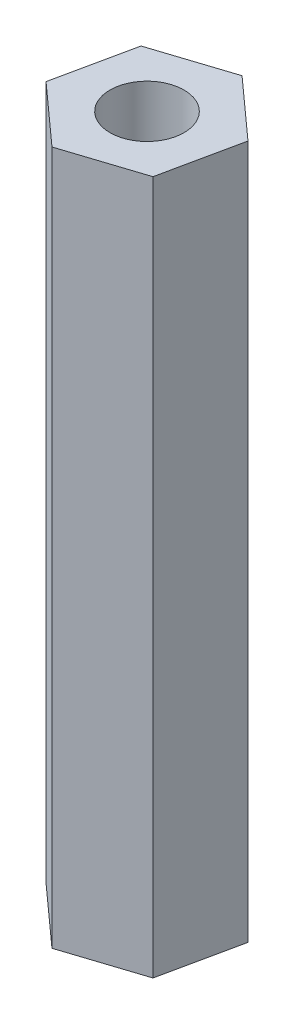
ISO-10303-21;
HEADER;
FILE_DESCRIPTION(('STEP AP214'),'2;1');
FILE_NAME('part.step','',(''),(''),'','','');
FILE_SCHEMA(('AUTOMOTIVE_DESIGN { 1 0 10303 214 1 1 1 1 }'));
ENDSEC;
DATA;
#1=APPLICATION_CONTEXT('core data for automotive mechanical design processes');
#2=APPLICATION_PROTOCOL_DEFINITION('international standard','automotive_design',2000,#1);
#3=PRODUCT_CONTEXT('',#1,'mechanical');
#4=PRODUCT('Part','Part','',(#3));
#5=PRODUCT_RELATED_PRODUCT_CATEGORY('part','',(#4));
#6=PRODUCT_DEFINITION_FORMATION('','',#4);
#7=PRODUCT_DEFINITION_CONTEXT('part definition',#1,'design');
#8=PRODUCT_DEFINITION('design','',#6,#7);
#9=PRODUCT_DEFINITION_SHAPE('','',#8);
#10=(LENGTH_UNIT() NAMED_UNIT(*) SI_UNIT(.MILLI.,.METRE.));
#11=(NAMED_UNIT(*) PLANE_ANGLE_UNIT() SI_UNIT($,.RADIAN.));
#12=(NAMED_UNIT(*) SI_UNIT($,.STERADIAN.) SOLID_ANGLE_UNIT());
#13=UNCERTAINTY_MEASURE_WITH_UNIT(LENGTH_MEASURE(1.E-05),#10,'distance_accuracy_value','');
#14=(GEOMETRIC_REPRESENTATION_CONTEXT(3) GLOBAL_UNCERTAINTY_ASSIGNED_CONTEXT((#13)) GLOBAL_UNIT_ASSIGNED_CONTEXT((#10,
#11,#12)) REPRESENTATION_CONTEXT('',''));
#15=CARTESIAN_POINT('',(0.,0.,0.));
#16=DIRECTION('',(0.,0.,1.));
#17=DIRECTION('',(1.,0.,0.));
#18=AXIS2_PLACEMENT_3D('',#15,#16,#17);
#19=CARTESIAN_POINT('',(0.,30.,0.));
#20=DIRECTION('',(0.,1.,0.));
#21=DIRECTION('',(0.,0.,1.));
#22=AXIS2_PLACEMENT_3D('',#19,#20,#21);
#23=PLANE('',#22);
#24=DIRECTION('',(0.95098752494446,0.,-0.309229247323097));
#25=VECTOR('',#24,1.);
#26=CARTESIAN_POINT('',(-0.719470968598688,30.,3.38856334238327));
#27=LINE('',#26,#25);
#28=CARTESIAN_POINT('',(-0.719470968598688,30.,3.38856334238327));
#29=VERTEX_POINT('',#28);
#30=CARTESIAN_POINT('',(2.57484645253727,30.,2.3173618072835));
#31=VERTEX_POINT('',#30);
#32=EDGE_CURVE('E150',#29,#31,#27,.T.);
#33=ORIENTED_EDGE('',*,*,#32,.T.);
#34=DIRECTION('',(0.207693378697287,0.,-0.978193978945539));
#35=VECTOR('',#34,1.);
#36=CARTESIAN_POINT('',(2.57484645253727,30.,2.3173618072835));
#37=LINE('',#36,#35);
#38=CARTESIAN_POINT('',(3.29431742113596,30.,-1.07120153509977));
#39=VERTEX_POINT('',#38);
#40=EDGE_CURVE('E98',#31,#39,#37,.T.);
#41=ORIENTED_EDGE('',*,*,#40,.T.);
#42=DIRECTION('',(-0.743294146247174,0.,-0.668964731622442));
#43=VECTOR('',#42,1.);
#44=CARTESIAN_POINT('',(3.29431742113596,30.,-1.07120153509977));
#45=LINE('',#44,#43);
#46=CARTESIAN_POINT('',(0.719470968598688,30.,-3.38856334238327));
#47=VERTEX_POINT('',#46);
#48=EDGE_CURVE('E111',#39,#47,#45,.T.);
#49=ORIENTED_EDGE('',*,*,#48,.T.);
#50=DIRECTION('',(-0.95098752494446,0.,0.309229247323097));
#51=VECTOR('',#50,1.);
#52=CARTESIAN_POINT('',(0.719470968598688,30.,-3.38856334238327));
#53=LINE('',#52,#51);
#54=CARTESIAN_POINT('',(-2.57484645253727,30.,-2.3173618072835));
#55=VERTEX_POINT('',#54);
#56=EDGE_CURVE('E105',#47,#55,#53,.T.);
#57=ORIENTED_EDGE('',*,*,#56,.T.);
#58=DIRECTION('',(-0.207693378697287,0.,0.978193978945539));
#59=VECTOR('',#58,1.);
#60=CARTESIAN_POINT('',(-2.57484645253727,30.,-2.3173618072835));
#61=LINE('',#60,#59);
#62=CARTESIAN_POINT('',(-3.29431742113596,30.,1.07120153509978));
#63=VERTEX_POINT('',#62);
#64=EDGE_CURVE('E109',#55,#63,#61,.T.);
#65=ORIENTED_EDGE('',*,*,#64,.T.);
#66=DIRECTION('',(0.743294146247174,0.,0.668964731622442));
#67=VECTOR('',#66,1.);
#68=CARTESIAN_POINT('',(-3.29431742113596,30.,1.07120153509978));
#69=LINE('',#68,#67);
#70=EDGE_CURVE('E61',#63,#29,#69,.T.);
#71=ORIENTED_EDGE('',*,*,#70,.T.);
#72=EDGE_LOOP('',(#33,#41,#49,#57,#65,#71));
#73=FACE_BOUND('',#72,.T.);
#74=CARTESIAN_POINT('',(0.,30.,0.));
#75=DIRECTION('',(0.,1.,0.));
#76=DIRECTION('',(0.,0.,1.));
#77=AXIS2_PLACEMENT_3D('',#74,#75,#76);
#78=CIRCLE('',#77,1.6);
#79=CARTESIAN_POINT('',(0.,30.,1.6));
#80=VERTEX_POINT('',#79);
#81=EDGE_CURVE('E138',#80,#80,#78,.T.);
#82=ORIENTED_EDGE('',*,*,#81,.F.);
#83=EDGE_LOOP('',(#82));
#84=FACE_BOUND('',#83,.T.);
#85=ADVANCED_FACE('F43',(#73,#84),#23,.T.);
#86=CARTESIAN_POINT('',(0.,0.,0.));
#87=DIRECTION('',(0.,1.,0.));
#88=DIRECTION('',(0.,0.,1.));
#89=AXIS2_PLACEMENT_3D('',#86,#87,#88);
#90=PLANE('',#89);
#91=DIRECTION('',(0.95098752494446,0.,-0.309229247323097));
#92=VECTOR('',#91,1.);
#93=CARTESIAN_POINT('',(-0.719470968598688,0.,3.38856334238327));
#94=LINE('',#93,#92);
#95=CARTESIAN_POINT('',(-0.719470968598688,0.,3.38856334238327));
#96=VERTEX_POINT('',#95);
#97=CARTESIAN_POINT('',(2.57484645253727,0.,2.3173618072835));
#98=VERTEX_POINT('',#97);
#99=EDGE_CURVE('E133',#96,#98,#94,.T.);
#100=ORIENTED_EDGE('',*,*,#99,.F.);
#101=DIRECTION('',(0.743294146247174,0.,0.668964731622442));
#102=VECTOR('',#101,1.);
#103=CARTESIAN_POINT('',(-3.29431742113596,0.,1.07120153509978));
#104=LINE('',#103,#102);
#105=CARTESIAN_POINT('',(-3.29431742113596,0.,1.07120153509978));
#106=VERTEX_POINT('',#105);
#107=EDGE_CURVE('E90',#106,#96,#104,.T.);
#108=ORIENTED_EDGE('',*,*,#107,.F.);
#109=DIRECTION('',(-0.207693378697287,0.,0.978193978945539));
#110=VECTOR('',#109,1.);
#111=CARTESIAN_POINT('',(-2.57484645253727,0.,-2.3173618072835));
#112=LINE('',#111,#110);
#113=CARTESIAN_POINT('',(-2.57484645253727,0.,-2.3173618072835));
#114=VERTEX_POINT('',#113);
#115=EDGE_CURVE('E84',#114,#106,#112,.T.);
#116=ORIENTED_EDGE('',*,*,#115,.F.);
#117=DIRECTION('',(-0.95098752494446,0.,0.309229247323097));
#118=VECTOR('',#117,1.);
#119=CARTESIAN_POINT('',(0.719470968598688,0.,-3.38856334238327));
#120=LINE('',#119,#118);
#121=CARTESIAN_POINT('',(0.719470968598688,0.,-3.38856334238327));
#122=VERTEX_POINT('',#121);
#123=EDGE_CURVE('E120',#122,#114,#120,.T.);
#124=ORIENTED_EDGE('',*,*,#123,.F.);
#125=DIRECTION('',(-0.743294146247174,0.,-0.668964731622442));
#126=VECTOR('',#125,1.);
#127=CARTESIAN_POINT('',(3.29431742113596,0.,-1.07120153509977));
#128=LINE('',#127,#126);
#129=CARTESIAN_POINT('',(3.29431742113596,0.,-1.07120153509977));
#130=VERTEX_POINT('',#129);
#131=EDGE_CURVE('E141',#130,#122,#128,.T.);
#132=ORIENTED_EDGE('',*,*,#131,.F.);
#133=DIRECTION('',(0.207693378697287,0.,-0.978193978945539));
#134=VECTOR('',#133,1.);
#135=CARTESIAN_POINT('',(2.57484645253727,0.,2.3173618072835));
#136=LINE('',#135,#134);
#137=EDGE_CURVE('E137',#98,#130,#136,.T.);
#138=ORIENTED_EDGE('',*,*,#137,.F.);
#139=EDGE_LOOP('',(#100,#108,#116,#124,#132,#138));
#140=FACE_BOUND('',#139,.T.);
#141=CARTESIAN_POINT('',(0.,0.,0.));
#142=DIRECTION('',(0.,1.,0.));
#143=DIRECTION('',(0.,0.,1.));
#144=AXIS2_PLACEMENT_3D('',#141,#142,#143);
#145=CIRCLE('',#144,1.6);
#146=CARTESIAN_POINT('',(0.,0.,1.6));
#147=VERTEX_POINT('',#146);
#148=EDGE_CURVE('E265',#147,#147,#145,.T.);
#149=ORIENTED_EDGE('',*,*,#148,.T.);
#150=EDGE_LOOP('',(#149));
#151=FACE_BOUND('',#150,.T.);
#152=ADVANCED_FACE('F163',(#140,#151),#90,.F.);
#153=CARTESIAN_POINT('',(-0.719470968598688,30.,3.38856334238327));
#154=DIRECTION('',(-0.309229247323097,0.,-0.95098752494446));
#155=DIRECTION('',(-0.95098752494446,0.,0.309229247323097));
#156=AXIS2_PLACEMENT_3D('',#153,#154,#155);
#157=PLANE('',#156);
#158=ORIENTED_EDGE('',*,*,#99,.T.);
#159=DIRECTION('',(0.,-1.,0.));
#160=VECTOR('',#159,1.);
#161=CARTESIAN_POINT('',(2.57484645253727,30.,2.3173618072835));
#162=LINE('',#161,#160);
#163=EDGE_CURVE('E11',#31,#98,#162,.T.);
#164=ORIENTED_EDGE('',*,*,#163,.F.);
#165=ORIENTED_EDGE('',*,*,#32,.F.);
#166=DIRECTION('',(0.,-1.,0.));
#167=VECTOR('',#166,1.);
#168=CARTESIAN_POINT('',(-0.719470968598688,30.,3.38856334238327));
#169=LINE('',#168,#167);
#170=EDGE_CURVE('E129',#29,#96,#169,.T.);
#171=ORIENTED_EDGE('',*,*,#170,.T.);
#172=EDGE_LOOP('',(#158,#164,#165,#171));
#173=FACE_BOUND('',#172,.T.);
#174=ADVANCED_FACE('F45',(#173),#157,.F.);
#175=CARTESIAN_POINT('',(2.57484645253727,30.,2.3173618072835));
#176=DIRECTION('',(-0.978193978945539,0.,-0.207693378697286));
#177=DIRECTION('',(-0.207693378697287,0.,0.978193978945539));
#178=AXIS2_PLACEMENT_3D('',#175,#176,#177);
#179=PLANE('',#178);
#180=ORIENTED_EDGE('',*,*,#137,.T.);
#181=DIRECTION('',(0.,-1.,0.));
#182=VECTOR('',#181,1.);
#183=CARTESIAN_POINT('',(3.29431742113596,30.,-1.07120153509977));
#184=LINE('',#183,#182);
#185=EDGE_CURVE('E53',#39,#130,#184,.T.);
#186=ORIENTED_EDGE('',*,*,#185,.F.);
#187=ORIENTED_EDGE('',*,*,#40,.F.);
#188=ORIENTED_EDGE('',*,*,#163,.T.);
#189=EDGE_LOOP('',(#180,#186,#187,#188));
#190=FACE_BOUND('',#189,.T.);
#191=ADVANCED_FACE('F188',(#190),#179,.F.);
#192=CARTESIAN_POINT('',(3.29431742113596,30.,-1.07120153509977));
#193=DIRECTION('',(-0.668964731622442,0.,0.743294146247174));
#194=DIRECTION('',(0.743294146247174,0.,0.668964731622442));
#195=AXIS2_PLACEMENT_3D('',#192,#193,#194);
#196=PLANE('',#195);
#197=ORIENTED_EDGE('',*,*,#131,.T.);
#198=DIRECTION('',(0.,-1.,0.));
#199=VECTOR('',#198,1.);
#200=CARTESIAN_POINT('',(0.719470968598688,30.,-3.38856334238327));
#201=LINE('',#200,#199);
#202=EDGE_CURVE('E122',#47,#122,#201,.T.);
#203=ORIENTED_EDGE('',*,*,#202,.F.);
#204=ORIENTED_EDGE('',*,*,#48,.F.);
#205=ORIENTED_EDGE('',*,*,#185,.T.);
#206=EDGE_LOOP('',(#197,#203,#204,#205));
#207=FACE_BOUND('',#206,.T.);
#208=ADVANCED_FACE('F160',(#207),#196,.F.);
#209=CARTESIAN_POINT('',(0.719470968598688,30.,-3.38856334238327));
#210=DIRECTION('',(0.309229247323097,0.,0.95098752494446));
#211=DIRECTION('',(0.95098752494446,0.,-0.309229247323097));
#212=AXIS2_PLACEMENT_3D('',#209,#210,#211);
#213=PLANE('',#212);
#214=ORIENTED_EDGE('',*,*,#123,.T.);
#215=DIRECTION('',(0.,-1.,0.));
#216=VECTOR('',#215,1.);
#217=CARTESIAN_POINT('',(-2.57484645253727,30.,-2.3173618072835));
#218=LINE('',#217,#216);
#219=EDGE_CURVE('E117',#55,#114,#218,.T.);
#220=ORIENTED_EDGE('',*,*,#219,.F.);
#221=ORIENTED_EDGE('',*,*,#56,.F.);
#222=ORIENTED_EDGE('',*,*,#202,.T.);
#223=EDGE_LOOP('',(#214,#220,#221,#222));
#224=FACE_BOUND('',#223,.T.);
#225=ADVANCED_FACE('F118',(#224),#213,.F.);
#226=CARTESIAN_POINT('',(-2.57484645253727,30.,-2.3173618072835));
#227=DIRECTION('',(0.978193978945539,0.,0.207693378697286));
#228=DIRECTION('',(0.207693378697287,0.,-0.978193978945539));
#229=AXIS2_PLACEMENT_3D('',#226,#227,#228);
#230=PLANE('',#229);
#231=ORIENTED_EDGE('',*,*,#115,.T.);
#232=DIRECTION('',(0.,-1.,0.));
#233=VECTOR('',#232,1.);
#234=CARTESIAN_POINT('',(-3.29431742113596,30.,1.07120153509978));
#235=LINE('',#234,#233);
#236=EDGE_CURVE('E123',#63,#106,#235,.T.);
#237=ORIENTED_EDGE('',*,*,#236,.F.);
#238=ORIENTED_EDGE('',*,*,#64,.F.);
#239=ORIENTED_EDGE('',*,*,#219,.T.);
#240=EDGE_LOOP('',(#231,#237,#238,#239));
#241=FACE_BOUND('',#240,.T.);
#242=ADVANCED_FACE('F125',(#241),#230,.F.);
#243=CARTESIAN_POINT('',(-3.29431742113596,30.,1.07120153509978));
#244=DIRECTION('',(0.668964731622442,0.,-0.743294146247174));
#245=DIRECTION('',(-0.743294146247174,0.,-0.668964731622442));
#246=AXIS2_PLACEMENT_3D('',#243,#244,#245);
#247=PLANE('',#246);
#248=ORIENTED_EDGE('',*,*,#107,.T.);
#249=ORIENTED_EDGE('',*,*,#170,.F.);
#250=ORIENTED_EDGE('',*,*,#70,.F.);
#251=ORIENTED_EDGE('',*,*,#236,.T.);
#252=EDGE_LOOP('',(#248,#249,#250,#251));
#253=FACE_BOUND('',#252,.T.);
#254=ADVANCED_FACE('F168',(#253),#247,.F.);
#255=CARTESIAN_POINT('',(0.,30.,0.));
#256=DIRECTION('',(0.,-1.,0.));
#257=DIRECTION('',(0.,0.,-1.));
#258=AXIS2_PLACEMENT_3D('',#255,#256,#257);
#259=CYLINDRICAL_SURFACE('',#258,1.6);
#260=ORIENTED_EDGE('',*,*,#81,.T.);
#261=EDGE_LOOP('',(#260));
#262=FACE_BOUND('',#261,.T.);
#263=ORIENTED_EDGE('',*,*,#148,.F.);
#264=EDGE_LOOP('',(#263));
#265=FACE_BOUND('',#264,.T.);
#266=ADVANCED_FACE('F170',(#262,#265),#259,.F.);
#267=CLOSED_SHELL('',(#85,#152,#174,#191,#208,#225,#242,#254,#266));
#268=MANIFOLD_SOLID_BREP('B2',#267);
#269=ADVANCED_BREP_SHAPE_REPRESENTATION('',(#18,#268),#14);
#270=SHAPE_DEFINITION_REPRESENTATION(#9,#269);
ENDSEC;
END-ISO-10303-21;
